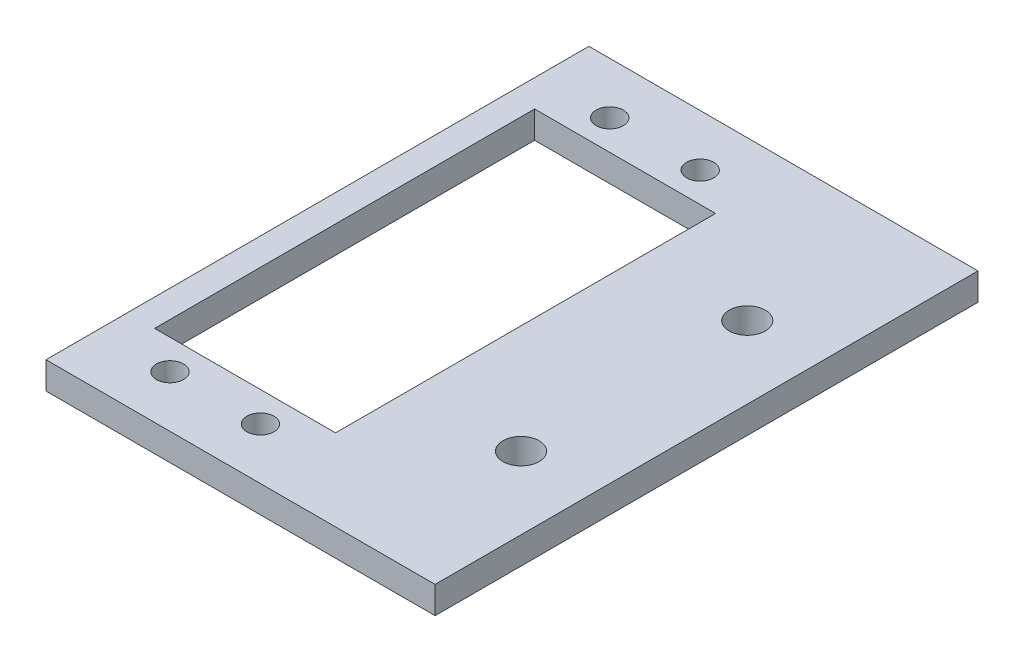
ISO-10303-21;
HEADER;
FILE_DESCRIPTION(('STEP AP214'),'2;1');
FILE_NAME('part.step','',(''),(''),'','','');
FILE_SCHEMA(('AUTOMOTIVE_DESIGN { 1 0 10303 214 1 1 1 1 }'));
ENDSEC;
DATA;
#1=APPLICATION_CONTEXT('core data for automotive mechanical design processes');
#2=APPLICATION_PROTOCOL_DEFINITION('international standard','automotive_design',2000,#1);
#3=PRODUCT_CONTEXT('',#1,'mechanical');
#4=PRODUCT('Part','Part','',(#3));
#5=PRODUCT_RELATED_PRODUCT_CATEGORY('part','',(#4));
#6=PRODUCT_DEFINITION_FORMATION('','',#4);
#7=PRODUCT_DEFINITION_CONTEXT('part definition',#1,'design');
#8=PRODUCT_DEFINITION('design','',#6,#7);
#9=PRODUCT_DEFINITION_SHAPE('','',#8);
#10=(LENGTH_UNIT() NAMED_UNIT(*) SI_UNIT(.MILLI.,.METRE.));
#11=(NAMED_UNIT(*) PLANE_ANGLE_UNIT() SI_UNIT($,.RADIAN.));
#12=(NAMED_UNIT(*) SI_UNIT($,.STERADIAN.) SOLID_ANGLE_UNIT());
#13=UNCERTAINTY_MEASURE_WITH_UNIT(LENGTH_MEASURE(1.E-05),#10,'distance_accuracy_value','');
#14=(GEOMETRIC_REPRESENTATION_CONTEXT(3) GLOBAL_UNCERTAINTY_ASSIGNED_CONTEXT((#13)) GLOBAL_UNIT_ASSIGNED_CONTEXT((#10,
#11,#12)) REPRESENTATION_CONTEXT('',''));
#15=CARTESIAN_POINT('',(0.,0.,0.));
#16=DIRECTION('',(0.,0.,1.));
#17=DIRECTION('',(1.,0.,0.));
#18=AXIS2_PLACEMENT_3D('',#15,#16,#17);
#19=CARTESIAN_POINT('',(0.,3.,0.));
#20=DIRECTION('',(0.,1.,0.));
#21=DIRECTION('',(0.,0.,1.));
#22=AXIS2_PLACEMENT_3D('',#19,#20,#21);
#23=PLANE('',#22);
#24=CARTESIAN_POINT('',(35.,3.,17.5));
#25=DIRECTION('',(0.,1.,0.));
#26=DIRECTION('',(0.,0.,1.));
#27=AXIS2_PLACEMENT_3D('',#24,#25,#26);
#28=CIRCLE('',#27,2.);
#29=CARTESIAN_POINT('',(35.,3.,19.5));
#30=VERTEX_POINT('',#29);
#31=EDGE_CURVE('E131',#30,#30,#28,.T.);
#32=ORIENTED_EDGE('',*,*,#31,.F.);
#33=EDGE_LOOP('',(#32));
#34=FACE_BOUND('',#33,.T.);
#35=CARTESIAN_POINT('',(8.,3.,54.3));
#36=DIRECTION('',(0.,1.,0.));
#37=DIRECTION('',(0.,0.,1.));
#38=AXIS2_PLACEMENT_3D('',#35,#36,#37);
#39=CIRCLE('',#38,1.5);
#40=CARTESIAN_POINT('',(8.,3.,55.8));
#41=VERTEX_POINT('',#40);
#42=EDGE_CURVE('E147',#41,#41,#39,.T.);
#43=ORIENTED_EDGE('',*,*,#42,.F.);
#44=EDGE_LOOP('',(#43));
#45=FACE_BOUND('',#44,.T.);
#46=CARTESIAN_POINT('',(8.,3.,5.7));
#47=DIRECTION('',(0.,1.,0.));
#48=DIRECTION('',(0.,0.,1.));
#49=AXIS2_PLACEMENT_3D('',#46,#47,#48);
#50=CIRCLE('',#49,1.5);
#51=CARTESIAN_POINT('',(8.,3.,7.2));
#52=VERTEX_POINT('',#51);
#53=EDGE_CURVE('E159',#52,#52,#50,.T.);
#54=ORIENTED_EDGE('',*,*,#53,.F.);
#55=EDGE_LOOP('',(#54));
#56=FACE_BOUND('',#55,.T.);
#57=DIRECTION('',(-1.,0.,0.));
#58=VECTOR('',#57,1.);
#59=CARTESIAN_POINT('',(43.,3.,0.));
#60=LINE('',#59,#58);
#61=CARTESIAN_POINT('',(43.,3.,0.));
#62=VERTEX_POINT('',#61);
#63=CARTESIAN_POINT('',(0.,3.,0.));
#64=VERTEX_POINT('',#63);
#65=EDGE_CURVE('E165',#62,#64,#60,.T.);
#66=ORIENTED_EDGE('',*,*,#65,.T.);
#67=DIRECTION('',(0.,0.,1.));
#68=VECTOR('',#67,1.);
#69=CARTESIAN_POINT('',(0.,3.,0.));
#70=LINE('',#69,#68);
#71=CARTESIAN_POINT('',(0.,3.,60.));
#72=VERTEX_POINT('',#71);
#73=EDGE_CURVE('E168',#64,#72,#70,.T.);
#74=ORIENTED_EDGE('',*,*,#73,.T.);
#75=DIRECTION('',(1.,0.,0.));
#76=VECTOR('',#75,1.);
#77=CARTESIAN_POINT('',(0.,3.,60.));
#78=LINE('',#77,#76);
#79=CARTESIAN_POINT('',(43.,3.,60.));
#80=VERTEX_POINT('',#79);
#81=EDGE_CURVE('E171',#72,#80,#78,.T.);
#82=ORIENTED_EDGE('',*,*,#81,.T.);
#83=DIRECTION('',(0.,0.,-1.));
#84=VECTOR('',#83,1.);
#85=CARTESIAN_POINT('',(43.,3.,60.));
#86=LINE('',#85,#84);
#87=EDGE_CURVE('E173',#80,#62,#86,.T.);
#88=ORIENTED_EDGE('',*,*,#87,.T.);
#89=EDGE_LOOP('',(#66,#74,#82,#88));
#90=FACE_BOUND('',#89,.T.);
#91=CARTESIAN_POINT('',(18.,3.,5.7));
#92=DIRECTION('',(0.,1.,0.));
#93=DIRECTION('',(0.,0.,1.));
#94=AXIS2_PLACEMENT_3D('',#91,#92,#93);
#95=CIRCLE('',#94,1.5);
#96=CARTESIAN_POINT('',(18.,3.,7.2));
#97=VERTEX_POINT('',#96);
#98=EDGE_CURVE('E153',#97,#97,#95,.T.);
#99=ORIENTED_EDGE('',*,*,#98,.F.);
#100=EDGE_LOOP('',(#99));
#101=FACE_BOUND('',#100,.T.);
#102=CARTESIAN_POINT('',(18.,3.,54.3));
#103=DIRECTION('',(0.,1.,0.));
#104=DIRECTION('',(0.,0.,1.));
#105=AXIS2_PLACEMENT_3D('',#102,#103,#104);
#106=CIRCLE('',#105,1.5);
#107=CARTESIAN_POINT('',(18.,3.,55.8));
#108=VERTEX_POINT('',#107);
#109=EDGE_CURVE('E141',#108,#108,#106,.T.);
#110=ORIENTED_EDGE('',*,*,#109,.F.);
#111=EDGE_LOOP('',(#110));
#112=FACE_BOUND('',#111,.T.);
#113=DIRECTION('',(-1.,0.,0.));
#114=VECTOR('',#113,1.);
#115=CARTESIAN_POINT('',(3.,3.,9.));
#116=LINE('',#115,#114);
#117=CARTESIAN_POINT('',(23.,3.,9.));
#118=VERTEX_POINT('',#117);
#119=CARTESIAN_POINT('',(3.,3.,9.));
#120=VERTEX_POINT('',#119);
#121=EDGE_CURVE('E110',#118,#120,#116,.T.);
#122=ORIENTED_EDGE('',*,*,#121,.F.);
#123=DIRECTION('',(0.,0.,-1.));
#124=VECTOR('',#123,1.);
#125=CARTESIAN_POINT('',(23.,3.,9.));
#126=LINE('',#125,#124);
#127=CARTESIAN_POINT('',(23.,3.,51.));
#128=VERTEX_POINT('',#127);
#129=EDGE_CURVE('E102',#128,#118,#126,.T.);
#130=ORIENTED_EDGE('',*,*,#129,.F.);
#131=DIRECTION('',(1.,0.,0.));
#132=VECTOR('',#131,1.);
#133=CARTESIAN_POINT('',(3.00000000000001,3.,51.));
#134=LINE('',#133,#132);
#135=CARTESIAN_POINT('',(3.00000000000001,3.,51.));
#136=VERTEX_POINT('',#135);
#137=EDGE_CURVE('E125',#136,#128,#134,.T.);
#138=ORIENTED_EDGE('',*,*,#137,.F.);
#139=DIRECTION('',(0.,0.,1.));
#140=VECTOR('',#139,1.);
#141=CARTESIAN_POINT('',(3.,3.,9.));
#142=LINE('',#141,#140);
#143=EDGE_CURVE('E123',#120,#136,#142,.T.);
#144=ORIENTED_EDGE('',*,*,#143,.F.);
#145=EDGE_LOOP('',(#122,#130,#138,#144));
#146=FACE_BOUND('',#145,.T.);
#147=CARTESIAN_POINT('',(35.,3.,42.5));
#148=DIRECTION('',(0.,1.,0.));
#149=DIRECTION('',(0.,0.,1.));
#150=AXIS2_PLACEMENT_3D('',#147,#148,#149);
#151=CIRCLE('',#150,2.);
#152=CARTESIAN_POINT('',(35.,3.,44.5));
#153=VERTEX_POINT('',#152);
#154=EDGE_CURVE('E280',#153,#153,#151,.T.);
#155=ORIENTED_EDGE('',*,*,#154,.F.);
#156=EDGE_LOOP('',(#155));
#157=FACE_BOUND('',#156,.T.);
#158=ADVANCED_FACE('F37',(#34,#45,#56,#90,#101,#112,#146,#157),#23,.T.);
#159=CARTESIAN_POINT('',(0.,0.,0.));
#160=DIRECTION('',(0.,1.,0.));
#161=DIRECTION('',(0.,0.,1.));
#162=AXIS2_PLACEMENT_3D('',#159,#160,#161);
#163=PLANE('',#162);
#164=CARTESIAN_POINT('',(18.,0.,54.3));
#165=DIRECTION('',(0.,1.,0.));
#166=DIRECTION('',(0.,0.,1.));
#167=AXIS2_PLACEMENT_3D('',#164,#165,#166);
#168=CIRCLE('',#167,1.5);
#169=CARTESIAN_POINT('',(18.,0.,55.8));
#170=VERTEX_POINT('',#169);
#171=EDGE_CURVE('E118',#170,#170,#168,.T.);
#172=ORIENTED_EDGE('',*,*,#171,.T.);
#173=EDGE_LOOP('',(#172));
#174=FACE_BOUND('',#173,.T.);
#175=CARTESIAN_POINT('',(8.,0.,54.3));
#176=DIRECTION('',(0.,1.,0.));
#177=DIRECTION('',(0.,0.,1.));
#178=AXIS2_PLACEMENT_3D('',#175,#176,#177);
#179=CIRCLE('',#178,1.5);
#180=CARTESIAN_POINT('',(8.,0.,55.8));
#181=VERTEX_POINT('',#180);
#182=EDGE_CURVE('E144',#181,#181,#179,.T.);
#183=ORIENTED_EDGE('',*,*,#182,.T.);
#184=EDGE_LOOP('',(#183));
#185=FACE_BOUND('',#184,.T.);
#186=CARTESIAN_POINT('',(18.,0.,5.7));
#187=DIRECTION('',(0.,1.,0.));
#188=DIRECTION('',(0.,0.,1.));
#189=AXIS2_PLACEMENT_3D('',#186,#187,#188);
#190=CIRCLE('',#189,1.5);
#191=CARTESIAN_POINT('',(18.,0.,7.2));
#192=VERTEX_POINT('',#191);
#193=EDGE_CURVE('E150',#192,#192,#190,.T.);
#194=ORIENTED_EDGE('',*,*,#193,.T.);
#195=EDGE_LOOP('',(#194));
#196=FACE_BOUND('',#195,.T.);
#197=CARTESIAN_POINT('',(8.,0.,5.7));
#198=DIRECTION('',(0.,1.,0.));
#199=DIRECTION('',(0.,0.,1.));
#200=AXIS2_PLACEMENT_3D('',#197,#198,#199);
#201=CIRCLE('',#200,1.5);
#202=CARTESIAN_POINT('',(8.,0.,7.2));
#203=VERTEX_POINT('',#202);
#204=EDGE_CURVE('E156',#203,#203,#201,.T.);
#205=ORIENTED_EDGE('',*,*,#204,.T.);
#206=EDGE_LOOP('',(#205));
#207=FACE_BOUND('',#206,.T.);
#208=DIRECTION('',(-1.,0.,0.));
#209=VECTOR('',#208,1.);
#210=CARTESIAN_POINT('',(43.,0.,0.));
#211=LINE('',#210,#209);
#212=CARTESIAN_POINT('',(43.,0.,0.));
#213=VERTEX_POINT('',#212);
#214=CARTESIAN_POINT('',(0.,0.,0.));
#215=VERTEX_POINT('',#214);
#216=EDGE_CURVE('E162',#213,#215,#211,.T.);
#217=ORIENTED_EDGE('',*,*,#216,.F.);
#218=DIRECTION('',(0.,0.,-1.));
#219=VECTOR('',#218,1.);
#220=CARTESIAN_POINT('',(43.,0.,60.));
#221=LINE('',#220,#219);
#222=CARTESIAN_POINT('',(43.,0.,60.));
#223=VERTEX_POINT('',#222);
#224=EDGE_CURVE('E169',#223,#213,#221,.T.);
#225=ORIENTED_EDGE('',*,*,#224,.F.);
#226=DIRECTION('',(1.,0.,0.));
#227=VECTOR('',#226,1.);
#228=CARTESIAN_POINT('',(0.,0.,60.));
#229=LINE('',#228,#227);
#230=CARTESIAN_POINT('',(0.,0.,60.));
#231=VERTEX_POINT('',#230);
#232=EDGE_CURVE('E180',#231,#223,#229,.T.);
#233=ORIENTED_EDGE('',*,*,#232,.F.);
#234=DIRECTION('',(0.,0.,1.));
#235=VECTOR('',#234,1.);
#236=CARTESIAN_POINT('',(0.,0.,0.));
#237=LINE('',#236,#235);
#238=EDGE_CURVE('E178',#215,#231,#237,.T.);
#239=ORIENTED_EDGE('',*,*,#238,.F.);
#240=EDGE_LOOP('',(#217,#225,#233,#239));
#241=FACE_BOUND('',#240,.T.);
#242=DIRECTION('',(0.,0.,-1.));
#243=VECTOR('',#242,1.);
#244=CARTESIAN_POINT('',(23.,0.,9.));
#245=LINE('',#244,#243);
#246=CARTESIAN_POINT('',(23.,0.,51.));
#247=VERTEX_POINT('',#246);
#248=CARTESIAN_POINT('',(23.,0.,9.));
#249=VERTEX_POINT('',#248);
#250=EDGE_CURVE('E60',#247,#249,#245,.T.);
#251=ORIENTED_EDGE('',*,*,#250,.T.);
#252=DIRECTION('',(-1.,0.,0.));
#253=VECTOR('',#252,1.);
#254=CARTESIAN_POINT('',(3.,0.,9.));
#255=LINE('',#254,#253);
#256=CARTESIAN_POINT('',(3.,0.,9.));
#257=VERTEX_POINT('',#256);
#258=EDGE_CURVE('E117',#249,#257,#255,.T.);
#259=ORIENTED_EDGE('',*,*,#258,.T.);
#260=DIRECTION('',(0.,0.,1.));
#261=VECTOR('',#260,1.);
#262=CARTESIAN_POINT('',(3.,0.,9.));
#263=LINE('',#262,#261);
#264=CARTESIAN_POINT('',(3.00000000000001,0.,51.));
#265=VERTEX_POINT('',#264);
#266=EDGE_CURVE('E133',#257,#265,#263,.T.);
#267=ORIENTED_EDGE('',*,*,#266,.T.);
#268=DIRECTION('',(1.,0.,0.));
#269=VECTOR('',#268,1.);
#270=CARTESIAN_POINT('',(3.00000000000001,0.,51.));
#271=LINE('',#270,#269);
#272=EDGE_CURVE('E111',#265,#247,#271,.T.);
#273=ORIENTED_EDGE('',*,*,#272,.T.);
#274=EDGE_LOOP('',(#251,#259,#267,#273));
#275=FACE_BOUND('',#274,.T.);
#276=CARTESIAN_POINT('',(35.,0.,17.5));
#277=DIRECTION('',(0.,1.,0.));
#278=DIRECTION('',(0.,0.,1.));
#279=AXIS2_PLACEMENT_3D('',#276,#277,#278);
#280=CIRCLE('',#279,2.);
#281=CARTESIAN_POINT('',(35.,0.,19.5));
#282=VERTEX_POINT('',#281);
#283=EDGE_CURVE('E286',#282,#282,#280,.T.);
#284=ORIENTED_EDGE('',*,*,#283,.T.);
#285=EDGE_LOOP('',(#284));
#286=FACE_BOUND('',#285,.T.);
#287=CARTESIAN_POINT('',(35.,0.,42.5));
#288=DIRECTION('',(0.,1.,0.));
#289=DIRECTION('',(0.,0.,1.));
#290=AXIS2_PLACEMENT_3D('',#287,#288,#289);
#291=CIRCLE('',#290,2.);
#292=CARTESIAN_POINT('',(35.,0.,44.5));
#293=VERTEX_POINT('',#292);
#294=EDGE_CURVE('E283',#293,#293,#291,.T.);
#295=ORIENTED_EDGE('',*,*,#294,.T.);
#296=EDGE_LOOP('',(#295));
#297=FACE_BOUND('',#296,.T.);
#298=ADVANCED_FACE('F198',(#174,#185,#196,#207,#241,#275,#286,#297),#163,.F.);
#299=CARTESIAN_POINT('',(43.,3.,0.));
#300=DIRECTION('',(0.,0.,1.));
#301=DIRECTION('',(1.,0.,0.));
#302=AXIS2_PLACEMENT_3D('',#299,#300,#301);
#303=PLANE('',#302);
#304=ORIENTED_EDGE('',*,*,#216,.T.);
#305=DIRECTION('',(0.,-1.,0.));
#306=VECTOR('',#305,1.);
#307=CARTESIAN_POINT('',(0.,3.,0.));
#308=LINE('',#307,#306);
#309=EDGE_CURVE('E11',#64,#215,#308,.T.);
#310=ORIENTED_EDGE('',*,*,#309,.F.);
#311=ORIENTED_EDGE('',*,*,#65,.F.);
#312=DIRECTION('',(0.,-1.,0.));
#313=VECTOR('',#312,1.);
#314=CARTESIAN_POINT('',(43.,3.,0.));
#315=LINE('',#314,#313);
#316=EDGE_CURVE('E175',#62,#213,#315,.T.);
#317=ORIENTED_EDGE('',*,*,#316,.T.);
#318=EDGE_LOOP('',(#304,#310,#311,#317));
#319=FACE_BOUND('',#318,.T.);
#320=ADVANCED_FACE('F39',(#319),#303,.F.);
#321=CARTESIAN_POINT('',(0.,3.,0.));
#322=DIRECTION('',(1.,0.,0.));
#323=DIRECTION('',(0.,0.,-1.));
#324=AXIS2_PLACEMENT_3D('',#321,#322,#323);
#325=PLANE('',#324);
#326=ORIENTED_EDGE('',*,*,#238,.T.);
#327=DIRECTION('',(0.,-1.,0.));
#328=VECTOR('',#327,1.);
#329=CARTESIAN_POINT('',(0.,3.,60.));
#330=LINE('',#329,#328);
#331=EDGE_CURVE('E45',#72,#231,#330,.T.);
#332=ORIENTED_EDGE('',*,*,#331,.F.);
#333=ORIENTED_EDGE('',*,*,#73,.F.);
#334=ORIENTED_EDGE('',*,*,#309,.T.);
#335=EDGE_LOOP('',(#326,#332,#333,#334));
#336=FACE_BOUND('',#335,.T.);
#337=ADVANCED_FACE('F209',(#336),#325,.F.);
#338=CARTESIAN_POINT('',(0.,3.,60.));
#339=DIRECTION('',(0.,0.,-1.));
#340=DIRECTION('',(-1.,0.,0.));
#341=AXIS2_PLACEMENT_3D('',#338,#339,#340);
#342=PLANE('',#341);
#343=ORIENTED_EDGE('',*,*,#232,.T.);
#344=DIRECTION('',(0.,-1.,0.));
#345=VECTOR('',#344,1.);
#346=CARTESIAN_POINT('',(43.,3.,60.));
#347=LINE('',#346,#345);
#348=EDGE_CURVE('E185',#80,#223,#347,.T.);
#349=ORIENTED_EDGE('',*,*,#348,.F.);
#350=ORIENTED_EDGE('',*,*,#81,.F.);
#351=ORIENTED_EDGE('',*,*,#331,.T.);
#352=EDGE_LOOP('',(#343,#349,#350,#351));
#353=FACE_BOUND('',#352,.T.);
#354=ADVANCED_FACE('F192',(#353),#342,.F.);
#355=CARTESIAN_POINT('',(43.,3.,60.));
#356=DIRECTION('',(-1.,0.,0.));
#357=DIRECTION('',(0.,0.,1.));
#358=AXIS2_PLACEMENT_3D('',#355,#356,#357);
#359=PLANE('',#358);
#360=ORIENTED_EDGE('',*,*,#224,.T.);
#361=ORIENTED_EDGE('',*,*,#316,.F.);
#362=ORIENTED_EDGE('',*,*,#87,.F.);
#363=ORIENTED_EDGE('',*,*,#348,.T.);
#364=EDGE_LOOP('',(#360,#361,#362,#363));
#365=FACE_BOUND('',#364,.T.);
#366=ADVANCED_FACE('F202',(#365),#359,.F.);
#367=CARTESIAN_POINT('',(8.,3.,5.7));
#368=DIRECTION('',(0.,-1.,0.));
#369=DIRECTION('',(0.,0.,-1.));
#370=AXIS2_PLACEMENT_3D('',#367,#368,#369);
#371=CYLINDRICAL_SURFACE('',#370,1.5);
#372=ORIENTED_EDGE('',*,*,#53,.T.);
#373=EDGE_LOOP('',(#372));
#374=FACE_BOUND('',#373,.T.);
#375=ORIENTED_EDGE('',*,*,#204,.F.);
#376=EDGE_LOOP('',(#375));
#377=FACE_BOUND('',#376,.T.);
#378=ADVANCED_FACE('F227',(#374,#377),#371,.F.);
#379=CARTESIAN_POINT('',(18.,3.,5.7));
#380=DIRECTION('',(0.,-1.,0.));
#381=DIRECTION('',(0.,0.,-1.));
#382=AXIS2_PLACEMENT_3D('',#379,#380,#381);
#383=CYLINDRICAL_SURFACE('',#382,1.5);
#384=ORIENTED_EDGE('',*,*,#98,.T.);
#385=EDGE_LOOP('',(#384));
#386=FACE_BOUND('',#385,.T.);
#387=ORIENTED_EDGE('',*,*,#193,.F.);
#388=EDGE_LOOP('',(#387));
#389=FACE_BOUND('',#388,.T.);
#390=ADVANCED_FACE('F234',(#386,#389),#383,.F.);
#391=CARTESIAN_POINT('',(8.,3.,54.3));
#392=DIRECTION('',(0.,-1.,0.));
#393=DIRECTION('',(0.,0.,-1.));
#394=AXIS2_PLACEMENT_3D('',#391,#392,#393);
#395=CYLINDRICAL_SURFACE('',#394,1.5);
#396=ORIENTED_EDGE('',*,*,#42,.T.);
#397=EDGE_LOOP('',(#396));
#398=FACE_BOUND('',#397,.T.);
#399=ORIENTED_EDGE('',*,*,#182,.F.);
#400=EDGE_LOOP('',(#399));
#401=FACE_BOUND('',#400,.T.);
#402=ADVANCED_FACE('F239',(#398,#401),#395,.F.);
#403=CARTESIAN_POINT('',(18.,3.,54.3));
#404=DIRECTION('',(0.,-1.,0.));
#405=DIRECTION('',(0.,0.,-1.));
#406=AXIS2_PLACEMENT_3D('',#403,#404,#405);
#407=CYLINDRICAL_SURFACE('',#406,1.5);
#408=ORIENTED_EDGE('',*,*,#109,.T.);
#409=EDGE_LOOP('',(#408));
#410=FACE_BOUND('',#409,.T.);
#411=ORIENTED_EDGE('',*,*,#171,.F.);
#412=EDGE_LOOP('',(#411));
#413=FACE_BOUND('',#412,.T.);
#414=ADVANCED_FACE('F249',(#410,#413),#407,.F.);
#415=CARTESIAN_POINT('',(23.,3.,9.));
#416=DIRECTION('',(-1.,0.,0.));
#417=DIRECTION('',(0.,0.,1.));
#418=AXIS2_PLACEMENT_3D('',#415,#416,#417);
#419=PLANE('',#418);
#420=ORIENTED_EDGE('',*,*,#250,.F.);
#421=DIRECTION('',(0.,-1.,0.));
#422=VECTOR('',#421,1.);
#423=CARTESIAN_POINT('',(23.,3.,51.));
#424=LINE('',#423,#422);
#425=EDGE_CURVE('E106',#128,#247,#424,.T.);
#426=ORIENTED_EDGE('',*,*,#425,.F.);
#427=ORIENTED_EDGE('',*,*,#129,.T.);
#428=DIRECTION('',(0.,-1.,0.));
#429=VECTOR('',#428,1.);
#430=CARTESIAN_POINT('',(23.,3.,9.));
#431=LINE('',#430,#429);
#432=EDGE_CURVE('E105',#118,#249,#431,.T.);
#433=ORIENTED_EDGE('',*,*,#432,.T.);
#434=EDGE_LOOP('',(#420,#426,#427,#433));
#435=FACE_BOUND('',#434,.T.);
#436=ADVANCED_FACE('F104',(#435),#419,.T.);
#437=CARTESIAN_POINT('',(3.,3.,9.));
#438=DIRECTION('',(0.,0.,1.));
#439=DIRECTION('',(1.,0.,0.));
#440=AXIS2_PLACEMENT_3D('',#437,#438,#439);
#441=PLANE('',#440);
#442=ORIENTED_EDGE('',*,*,#258,.F.);
#443=ORIENTED_EDGE('',*,*,#432,.F.);
#444=ORIENTED_EDGE('',*,*,#121,.T.);
#445=DIRECTION('',(0.,-1.,0.));
#446=VECTOR('',#445,1.);
#447=CARTESIAN_POINT('',(3.,3.,9.));
#448=LINE('',#447,#446);
#449=EDGE_CURVE('E119',#120,#257,#448,.T.);
#450=ORIENTED_EDGE('',*,*,#449,.T.);
#451=EDGE_LOOP('',(#442,#443,#444,#450));
#452=FACE_BOUND('',#451,.T.);
#453=ADVANCED_FACE('F114',(#452),#441,.T.);
#454=CARTESIAN_POINT('',(3.,3.,9.));
#455=DIRECTION('',(1.,0.,0.));
#456=DIRECTION('',(0.,0.,-1.));
#457=AXIS2_PLACEMENT_3D('',#454,#455,#456);
#458=PLANE('',#457);
#459=ORIENTED_EDGE('',*,*,#266,.F.);
#460=ORIENTED_EDGE('',*,*,#449,.F.);
#461=ORIENTED_EDGE('',*,*,#143,.T.);
#462=DIRECTION('',(0.,-1.,0.));
#463=VECTOR('',#462,1.);
#464=CARTESIAN_POINT('',(3.00000000000001,3.,51.));
#465=LINE('',#464,#463);
#466=EDGE_CURVE('E52',#136,#265,#465,.T.);
#467=ORIENTED_EDGE('',*,*,#466,.T.);
#468=EDGE_LOOP('',(#459,#460,#461,#467));
#469=FACE_BOUND('',#468,.T.);
#470=ADVANCED_FACE('F261',(#469),#458,.T.);
#471=CARTESIAN_POINT('',(3.00000000000001,3.,51.));
#472=DIRECTION('',(0.,0.,-1.));
#473=DIRECTION('',(-1.,0.,0.));
#474=AXIS2_PLACEMENT_3D('',#471,#472,#473);
#475=PLANE('',#474);
#476=ORIENTED_EDGE('',*,*,#272,.F.);
#477=ORIENTED_EDGE('',*,*,#466,.F.);
#478=ORIENTED_EDGE('',*,*,#137,.T.);
#479=ORIENTED_EDGE('',*,*,#425,.T.);
#480=EDGE_LOOP('',(#476,#477,#478,#479));
#481=FACE_BOUND('',#480,.T.);
#482=ADVANCED_FACE('F264',(#481),#475,.T.);
#483=CARTESIAN_POINT('',(35.,3.,17.5));
#484=DIRECTION('',(0.,-1.,0.));
#485=DIRECTION('',(0.,0.,-1.));
#486=AXIS2_PLACEMENT_3D('',#483,#484,#485);
#487=CYLINDRICAL_SURFACE('',#486,2.);
#488=ORIENTED_EDGE('',*,*,#31,.T.);
#489=EDGE_LOOP('',(#488));
#490=FACE_BOUND('',#489,.T.);
#491=ORIENTED_EDGE('',*,*,#283,.F.);
#492=EDGE_LOOP('',(#491));
#493=FACE_BOUND('',#492,.T.);
#494=ADVANCED_FACE('F268',(#490,#493),#487,.F.);
#495=CARTESIAN_POINT('',(35.,3.,42.5));
#496=DIRECTION('',(0.,-1.,0.));
#497=DIRECTION('',(0.,0.,-1.));
#498=AXIS2_PLACEMENT_3D('',#495,#496,#497);
#499=CYLINDRICAL_SURFACE('',#498,2.);
#500=ORIENTED_EDGE('',*,*,#154,.T.);
#501=EDGE_LOOP('',(#500));
#502=FACE_BOUND('',#501,.T.);
#503=ORIENTED_EDGE('',*,*,#294,.F.);
#504=EDGE_LOOP('',(#503));
#505=FACE_BOUND('',#504,.T.);
#506=ADVANCED_FACE('F271',(#502,#505),#499,.F.);
#507=CLOSED_SHELL('',(#158,#298,#320,#337,#354,#366,#378,#390,#402,#414,#436,#453,#470,#482,
#494,#506));
#508=MANIFOLD_SOLID_BREP('B2',#507);
#509=ADVANCED_BREP_SHAPE_REPRESENTATION('',(#18,#508),#14);
#510=SHAPE_DEFINITION_REPRESENTATION(#9,#509);
ENDSEC;
END-ISO-10303-21;
